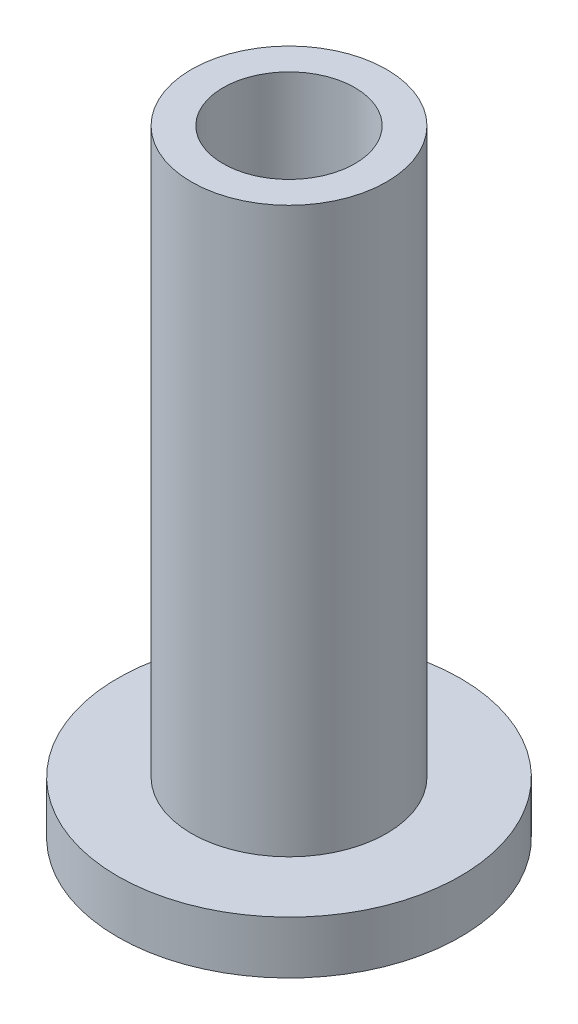
ISO-10303-21;
HEADER;
FILE_DESCRIPTION(('STEP AP214'),'2;1');
FILE_NAME('part.step','',(''),(''),'','','');
FILE_SCHEMA(('AUTOMOTIVE_DESIGN { 1 0 10303 214 1 1 1 1 }'));
ENDSEC;
DATA;
#1=APPLICATION_CONTEXT('core data for automotive mechanical design processes');
#2=APPLICATION_PROTOCOL_DEFINITION('international standard','automotive_design',2000,#1);
#3=PRODUCT_CONTEXT('',#1,'mechanical');
#4=PRODUCT('Part','Part','',(#3));
#5=PRODUCT_RELATED_PRODUCT_CATEGORY('part','',(#4));
#6=PRODUCT_DEFINITION_FORMATION('','',#4);
#7=PRODUCT_DEFINITION_CONTEXT('part definition',#1,'design');
#8=PRODUCT_DEFINITION('design','',#6,#7);
#9=PRODUCT_DEFINITION_SHAPE('','',#8);
#10=(LENGTH_UNIT() NAMED_UNIT(*) SI_UNIT(.MILLI.,.METRE.));
#11=(NAMED_UNIT(*) PLANE_ANGLE_UNIT() SI_UNIT($,.RADIAN.));
#12=(NAMED_UNIT(*) SI_UNIT($,.STERADIAN.) SOLID_ANGLE_UNIT());
#13=UNCERTAINTY_MEASURE_WITH_UNIT(LENGTH_MEASURE(1.E-05),#10,'distance_accuracy_value','');
#14=(GEOMETRIC_REPRESENTATION_CONTEXT(3) GLOBAL_UNCERTAINTY_ASSIGNED_CONTEXT((#13)) GLOBAL_UNIT_ASSIGNED_CONTEXT((#10,
#11,#12)) REPRESENTATION_CONTEXT('',''));
#15=CARTESIAN_POINT('',(0.,0.,0.));
#16=DIRECTION('',(0.,0.,1.));
#17=DIRECTION('',(1.,0.,0.));
#18=AXIS2_PLACEMENT_3D('',#15,#16,#17);
#19=CARTESIAN_POINT('',(0.,1.27,0.));
#20=DIRECTION('',(0.,1.,0.));
#21=DIRECTION('',(0.,0.,1.));
#22=AXIS2_PLACEMENT_3D('',#19,#20,#21);
#23=PLANE('',#22);
#24=CARTESIAN_POINT('',(0.,1.27,0.));
#25=DIRECTION('',(0.,1.,0.));
#26=DIRECTION('',(0.,0.,1.));
#27=AXIS2_PLACEMENT_3D('',#24,#25,#26);
#28=CIRCLE('',#27,4.1275);
#29=CARTESIAN_POINT('',(0.,1.27,4.1275));
#30=VERTEX_POINT('',#29);
#31=EDGE_CURVE('E10',#30,#30,#28,.T.);
#32=ORIENTED_EDGE('',*,*,#31,.T.);
#33=EDGE_LOOP('',(#32));
#34=FACE_BOUND('',#33,.T.);
#35=CARTESIAN_POINT('',(0.,1.27,0.));
#36=DIRECTION('',(0.,1.,0.));
#37=DIRECTION('',(0.,0.,1.));
#38=AXIS2_PLACEMENT_3D('',#35,#36,#37);
#39=CIRCLE('',#38,2.3495);
#40=CARTESIAN_POINT('',(0.,1.27,2.3495));
#41=VERTEX_POINT('',#40);
#42=EDGE_CURVE('E44',#41,#41,#39,.T.);
#43=ORIENTED_EDGE('',*,*,#42,.F.);
#44=EDGE_LOOP('',(#43));
#45=FACE_BOUND('',#44,.T.);
#46=ADVANCED_FACE('F31',(#34,#45),#23,.T.);
#47=CARTESIAN_POINT('',(0.,1.27,0.));
#48=DIRECTION('',(0.,-1.,0.));
#49=DIRECTION('',(0.,0.,-1.));
#50=AXIS2_PLACEMENT_3D('',#47,#48,#49);
#51=CYLINDRICAL_SURFACE('',#50,4.1275);
#52=ORIENTED_EDGE('',*,*,#31,.F.);
#53=EDGE_LOOP('',(#52));
#54=FACE_BOUND('',#53,.T.);
#55=CARTESIAN_POINT('',(0.,0.,0.));
#56=DIRECTION('',(0.,1.,0.));
#57=DIRECTION('',(0.,0.,1.));
#58=AXIS2_PLACEMENT_3D('',#55,#56,#57);
#59=CIRCLE('',#58,4.1275);
#60=CARTESIAN_POINT('',(0.,0.,4.1275));
#61=VERTEX_POINT('',#60);
#62=EDGE_CURVE('E35',#61,#61,#59,.T.);
#63=ORIENTED_EDGE('',*,*,#62,.T.);
#64=EDGE_LOOP('',(#63));
#65=FACE_BOUND('',#64,.T.);
#66=ADVANCED_FACE('F33',(#54,#65),#51,.T.);
#67=CARTESIAN_POINT('',(0.,0.,0.));
#68=DIRECTION('',(0.,1.,0.));
#69=DIRECTION('',(0.,0.,1.));
#70=AXIS2_PLACEMENT_3D('',#67,#68,#69);
#71=PLANE('',#70);
#72=CARTESIAN_POINT('',(0.,0.,0.));
#73=DIRECTION('',(0.,-1.,0.));
#74=DIRECTION('',(0.,0.,-1.));
#75=AXIS2_PLACEMENT_3D('',#72,#73,#74);
#76=CIRCLE('',#75,1.5875);
#77=CARTESIAN_POINT('',(0.,0.,-1.5875));
#78=VERTEX_POINT('',#77);
#79=EDGE_CURVE('E50',#78,#78,#76,.T.);
#80=ORIENTED_EDGE('',*,*,#79,.F.);
#81=EDGE_LOOP('',(#80));
#82=FACE_BOUND('',#81,.T.);
#83=ORIENTED_EDGE('',*,*,#62,.F.);
#84=EDGE_LOOP('',(#83));
#85=FACE_BOUND('',#84,.T.);
#86=ADVANCED_FACE('F65',(#82,#85),#71,.F.);
#87=CARTESIAN_POINT('',(0.,14.859,0.));
#88=DIRECTION('',(0.,-1.,0.));
#89=DIRECTION('',(0.,0.,-1.));
#90=AXIS2_PLACEMENT_3D('',#87,#88,#89);
#91=CYLINDRICAL_SURFACE('',#90,2.3495);
#92=CARTESIAN_POINT('',(0.,14.859,0.));
#93=DIRECTION('',(0.,1.,0.));
#94=DIRECTION('',(0.,0.,1.));
#95=AXIS2_PLACEMENT_3D('',#92,#93,#94);
#96=CIRCLE('',#95,2.3495);
#97=CARTESIAN_POINT('',(0.,14.859,2.3495));
#98=VERTEX_POINT('',#97);
#99=EDGE_CURVE('E42',#98,#98,#96,.T.);
#100=ORIENTED_EDGE('',*,*,#99,.F.);
#101=EDGE_LOOP('',(#100));
#102=FACE_BOUND('',#101,.T.);
#103=ORIENTED_EDGE('',*,*,#42,.T.);
#104=EDGE_LOOP('',(#103));
#105=FACE_BOUND('',#104,.T.);
#106=ADVANCED_FACE('F68',(#102,#105),#91,.T.);
#107=CARTESIAN_POINT('',(0.,14.859,0.));
#108=DIRECTION('',(0.,1.,0.));
#109=DIRECTION('',(0.,0.,1.));
#110=AXIS2_PLACEMENT_3D('',#107,#108,#109);
#111=PLANE('',#110);
#112=CARTESIAN_POINT('',(0.,14.859,0.));
#113=DIRECTION('',(0.,-1.,0.));
#114=DIRECTION('',(0.,0.,-1.));
#115=AXIS2_PLACEMENT_3D('',#112,#113,#114);
#116=CIRCLE('',#115,1.5875);
#117=CARTESIAN_POINT('',(0.,14.859,-1.5875));
#118=VERTEX_POINT('',#117);
#119=EDGE_CURVE('E47',#118,#118,#116,.T.);
#120=ORIENTED_EDGE('',*,*,#119,.T.);
#121=EDGE_LOOP('',(#120));
#122=FACE_BOUND('',#121,.T.);
#123=ORIENTED_EDGE('',*,*,#99,.T.);
#124=EDGE_LOOP('',(#123));
#125=FACE_BOUND('',#124,.T.);
#126=ADVANCED_FACE('F56',(#122,#125),#111,.T.);
#127=CARTESIAN_POINT('',(0.,14.859,0.));
#128=DIRECTION('',(0.,-1.,0.));
#129=DIRECTION('',(0.,0.,-1.));
#130=AXIS2_PLACEMENT_3D('',#127,#128,#129);
#131=CYLINDRICAL_SURFACE('',#130,1.5875);
#132=ORIENTED_EDGE('',*,*,#119,.F.);
#133=EDGE_LOOP('',(#132));
#134=FACE_BOUND('',#133,.T.);
#135=ORIENTED_EDGE('',*,*,#79,.T.);
#136=EDGE_LOOP('',(#135));
#137=FACE_BOUND('',#136,.T.);
#138=ADVANCED_FACE('F59',(#134,#137),#131,.F.);
#139=CLOSED_SHELL('',(#46,#66,#86,#106,#126,#138));
#140=MANIFOLD_SOLID_BREP('B2',#139);
#141=ADVANCED_BREP_SHAPE_REPRESENTATION('',(#18,#140),#14);
#142=SHAPE_DEFINITION_REPRESENTATION(#9,#141);
ENDSEC;
END-ISO-10303-21;
